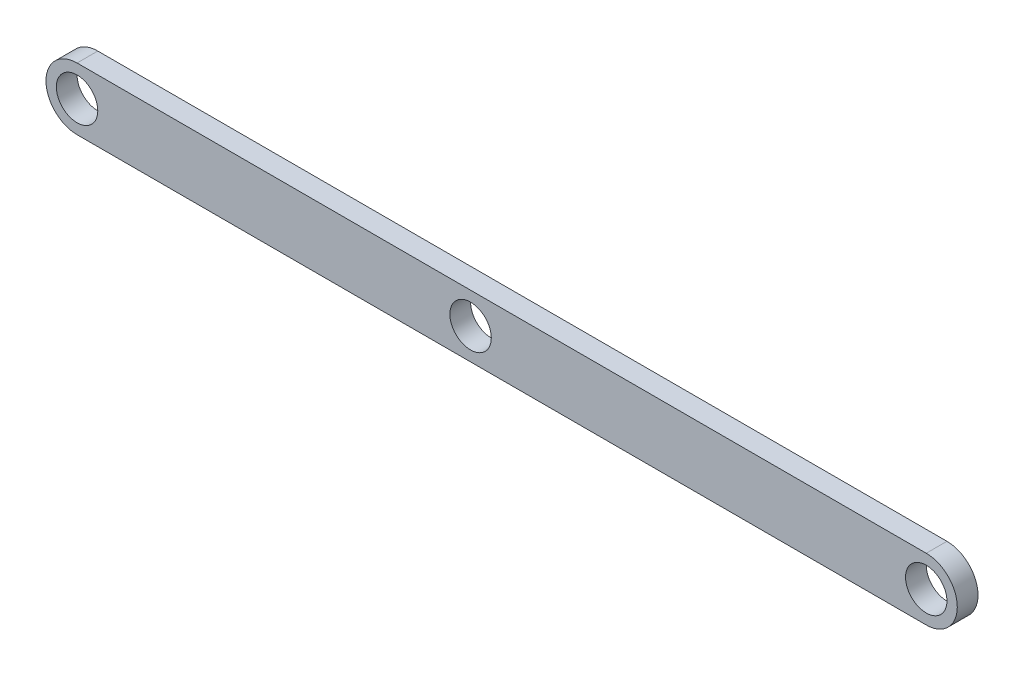
ISO-10303-21;
HEADER;
FILE_DESCRIPTION(('STEP AP214'),'2;1');
FILE_NAME('part.step','',(''),(''),'','','');
FILE_SCHEMA(('AUTOMOTIVE_DESIGN { 1 0 10303 214 1 1 1 1 }'));
ENDSEC;
DATA;
#1=APPLICATION_CONTEXT('core data for automotive mechanical design processes');
#2=APPLICATION_PROTOCOL_DEFINITION('international standard','automotive_design',2000,#1);
#3=PRODUCT_CONTEXT('',#1,'mechanical');
#4=PRODUCT('Part','Part','',(#3));
#5=PRODUCT_RELATED_PRODUCT_CATEGORY('part','',(#4));
#6=PRODUCT_DEFINITION_FORMATION('','',#4);
#7=PRODUCT_DEFINITION_CONTEXT('part definition',#1,'design');
#8=PRODUCT_DEFINITION('design','',#6,#7);
#9=PRODUCT_DEFINITION_SHAPE('','',#8);
#10=(LENGTH_UNIT() NAMED_UNIT(*) SI_UNIT(.MILLI.,.METRE.));
#11=(NAMED_UNIT(*) PLANE_ANGLE_UNIT() SI_UNIT($,.RADIAN.));
#12=(NAMED_UNIT(*) SI_UNIT($,.STERADIAN.) SOLID_ANGLE_UNIT());
#13=UNCERTAINTY_MEASURE_WITH_UNIT(LENGTH_MEASURE(1.E-05),#10,'distance_accuracy_value','');
#14=(GEOMETRIC_REPRESENTATION_CONTEXT(3) GLOBAL_UNCERTAINTY_ASSIGNED_CONTEXT((#13)) GLOBAL_UNIT_ASSIGNED_CONTEXT((#10,
#11,#12)) REPRESENTATION_CONTEXT('',''));
#15=CARTESIAN_POINT('',(0.,0.,0.));
#16=DIRECTION('',(0.,0.,1.));
#17=DIRECTION('',(1.,0.,0.));
#18=AXIS2_PLACEMENT_3D('',#15,#16,#17);
#19=CARTESIAN_POINT('',(0.,0.,10.));
#20=DIRECTION('',(0.,0.,1.));
#21=DIRECTION('',(1.,0.,0.));
#22=AXIS2_PLACEMENT_3D('',#19,#20,#21);
#23=PLANE('',#22);
#24=CARTESIAN_POINT('',(410.,0.,10.));
#25=DIRECTION('',(0.,0.,1.));
#26=DIRECTION('',(1.,0.,0.));
#27=AXIS2_PLACEMENT_3D('',#24,#25,#26);
#28=CIRCLE('',#27,10.);
#29=CARTESIAN_POINT('',(420.,0.,10.));
#30=VERTEX_POINT('',#29);
#31=EDGE_CURVE('E140',#30,#30,#28,.T.);
#32=ORIENTED_EDGE('',*,*,#31,.F.);
#33=EDGE_LOOP('',(#32));
#34=FACE_BOUND('',#33,.T.);
#35=CARTESIAN_POINT('',(0.,0.,10.));
#36=DIRECTION('',(0.,0.,1.));
#37=DIRECTION('',(1.,0.,0.));
#38=AXIS2_PLACEMENT_3D('',#35,#36,#37);
#39=CIRCLE('',#38,15.);
#40=CARTESIAN_POINT('',(0.,15.,10.));
#41=VERTEX_POINT('',#40);
#42=CARTESIAN_POINT('',(0.,-15.,10.));
#43=VERTEX_POINT('',#42);
#44=EDGE_CURVE('E98',#41,#43,#39,.T.);
#45=ORIENTED_EDGE('',*,*,#44,.T.);
#46=DIRECTION('',(1.,0.,0.));
#47=VECTOR('',#46,1.);
#48=CARTESIAN_POINT('',(0.,-15.,10.));
#49=LINE('',#48,#47);
#50=CARTESIAN_POINT('',(410.,-15.,10.));
#51=VERTEX_POINT('',#50);
#52=EDGE_CURVE('E93',#43,#51,#49,.T.);
#53=ORIENTED_EDGE('',*,*,#52,.T.);
#54=CARTESIAN_POINT('',(410.,0.,10.));
#55=DIRECTION('',(0.,0.,1.));
#56=DIRECTION('',(1.,0.,0.));
#57=AXIS2_PLACEMENT_3D('',#54,#55,#56);
#58=CIRCLE('',#57,15.);
#59=CARTESIAN_POINT('',(410.,15.,10.));
#60=VERTEX_POINT('',#59);
#61=EDGE_CURVE('E96',#51,#60,#58,.T.);
#62=ORIENTED_EDGE('',*,*,#61,.T.);
#63=DIRECTION('',(-1.,0.,0.));
#64=VECTOR('',#63,1.);
#65=CARTESIAN_POINT('',(0.,15.,10.));
#66=LINE('',#65,#64);
#67=EDGE_CURVE('E63',#60,#41,#66,.T.);
#68=ORIENTED_EDGE('',*,*,#67,.T.);
#69=EDGE_LOOP('',(#45,#53,#62,#68));
#70=FACE_BOUND('',#69,.T.);
#71=CARTESIAN_POINT('',(0.,0.,10.));
#72=DIRECTION('',(0.,0.,1.));
#73=DIRECTION('',(1.,0.,0.));
#74=AXIS2_PLACEMENT_3D('',#71,#72,#73);
#75=CIRCLE('',#74,10.);
#76=CARTESIAN_POINT('',(10.,0.,10.));
#77=VERTEX_POINT('',#76);
#78=EDGE_CURVE('E118',#77,#77,#75,.T.);
#79=ORIENTED_EDGE('',*,*,#78,.F.);
#80=EDGE_LOOP('',(#79));
#81=FACE_BOUND('',#80,.T.);
#82=CARTESIAN_POINT('',(190.,2.8421709430404E-11,10.));
#83=DIRECTION('',(0.,0.,1.));
#84=DIRECTION('',(1.,0.,0.));
#85=AXIS2_PLACEMENT_3D('',#82,#83,#84);
#86=CIRCLE('',#85,10.);
#87=CARTESIAN_POINT('',(200.,2.8421709430404E-11,10.));
#88=VERTEX_POINT('',#87);
#89=EDGE_CURVE('E148',#88,#88,#86,.T.);
#90=ORIENTED_EDGE('',*,*,#89,.F.);
#91=EDGE_LOOP('',(#90));
#92=FACE_BOUND('',#91,.T.);
#93=ADVANCED_FACE('F45',(#34,#70,#81,#92),#23,.T.);
#94=CARTESIAN_POINT('',(0.,0.,0.));
#95=DIRECTION('',(0.,0.,1.));
#96=DIRECTION('',(1.,0.,0.));
#97=AXIS2_PLACEMENT_3D('',#94,#95,#96);
#98=PLANE('',#97);
#99=CARTESIAN_POINT('',(0.,0.,0.));
#100=DIRECTION('',(0.,0.,1.));
#101=DIRECTION('',(1.,0.,0.));
#102=AXIS2_PLACEMENT_3D('',#99,#100,#101);
#103=CIRCLE('',#102,15.);
#104=CARTESIAN_POINT('',(0.,15.,0.));
#105=VERTEX_POINT('',#104);
#106=CARTESIAN_POINT('',(0.,-15.,0.));
#107=VERTEX_POINT('',#106);
#108=EDGE_CURVE('E114',#105,#107,#103,.T.);
#109=ORIENTED_EDGE('',*,*,#108,.F.);
#110=DIRECTION('',(-1.,0.,0.));
#111=VECTOR('',#110,1.);
#112=CARTESIAN_POINT('',(0.,15.,0.));
#113=LINE('',#112,#111);
#114=CARTESIAN_POINT('',(410.,15.,0.));
#115=VERTEX_POINT('',#114);
#116=EDGE_CURVE('E86',#115,#105,#113,.T.);
#117=ORIENTED_EDGE('',*,*,#116,.F.);
#118=CARTESIAN_POINT('',(410.,0.,0.));
#119=DIRECTION('',(0.,0.,1.));
#120=DIRECTION('',(1.,0.,0.));
#121=AXIS2_PLACEMENT_3D('',#118,#119,#120);
#122=CIRCLE('',#121,15.);
#123=CARTESIAN_POINT('',(410.,-15.,0.));
#124=VERTEX_POINT('',#123);
#125=EDGE_CURVE('E80',#124,#115,#122,.T.);
#126=ORIENTED_EDGE('',*,*,#125,.F.);
#127=DIRECTION('',(1.,0.,0.));
#128=VECTOR('',#127,1.);
#129=CARTESIAN_POINT('',(0.,-15.,0.));
#130=LINE('',#129,#128);
#131=EDGE_CURVE('E103',#107,#124,#130,.T.);
#132=ORIENTED_EDGE('',*,*,#131,.F.);
#133=EDGE_LOOP('',(#109,#117,#126,#132));
#134=FACE_BOUND('',#133,.T.);
#135=CARTESIAN_POINT('',(0.,0.,0.));
#136=DIRECTION('',(0.,0.,1.));
#137=DIRECTION('',(1.,0.,0.));
#138=AXIS2_PLACEMENT_3D('',#135,#136,#137);
#139=CIRCLE('',#138,10.);
#140=CARTESIAN_POINT('',(10.,0.,0.));
#141=VERTEX_POINT('',#140);
#142=EDGE_CURVE('E136',#141,#141,#139,.T.);
#143=ORIENTED_EDGE('',*,*,#142,.T.);
#144=EDGE_LOOP('',(#143));
#145=FACE_BOUND('',#144,.T.);
#146=CARTESIAN_POINT('',(410.,0.,0.));
#147=DIRECTION('',(0.,0.,1.));
#148=DIRECTION('',(1.,0.,0.));
#149=AXIS2_PLACEMENT_3D('',#146,#147,#148);
#150=CIRCLE('',#149,10.);
#151=CARTESIAN_POINT('',(420.,0.,0.));
#152=VERTEX_POINT('',#151);
#153=EDGE_CURVE('E144',#152,#152,#150,.T.);
#154=ORIENTED_EDGE('',*,*,#153,.T.);
#155=EDGE_LOOP('',(#154));
#156=FACE_BOUND('',#155,.T.);
#157=CARTESIAN_POINT('',(190.,2.8421709430404E-11,0.));
#158=DIRECTION('',(0.,0.,1.));
#159=DIRECTION('',(1.,0.,0.));
#160=AXIS2_PLACEMENT_3D('',#157,#158,#159);
#161=CIRCLE('',#160,10.);
#162=CARTESIAN_POINT('',(200.,2.8421709430404E-11,0.));
#163=VERTEX_POINT('',#162);
#164=EDGE_CURVE('E152',#163,#163,#161,.T.);
#165=ORIENTED_EDGE('',*,*,#164,.T.);
#166=EDGE_LOOP('',(#165));
#167=FACE_BOUND('',#166,.T.);
#168=ADVANCED_FACE('F131',(#134,#145,#156,#167),#98,.F.);
#169=CARTESIAN_POINT('',(0.,0.,10.));
#170=DIRECTION('',(0.,0.,-1.));
#171=DIRECTION('',(-1.,0.,0.));
#172=AXIS2_PLACEMENT_3D('',#169,#170,#171);
#173=CYLINDRICAL_SURFACE('',#172,15.);
#174=ORIENTED_EDGE('',*,*,#108,.T.);
#175=DIRECTION('',(0.,0.,-1.));
#176=VECTOR('',#175,1.);
#177=CARTESIAN_POINT('',(0.,-15.,10.));
#178=LINE('',#177,#176);
#179=EDGE_CURVE('E11',#43,#107,#178,.T.);
#180=ORIENTED_EDGE('',*,*,#179,.F.);
#181=ORIENTED_EDGE('',*,*,#44,.F.);
#182=DIRECTION('',(0.,0.,-1.));
#183=VECTOR('',#182,1.);
#184=CARTESIAN_POINT('',(0.,15.,10.));
#185=LINE('',#184,#183);
#186=EDGE_CURVE('E110',#41,#105,#185,.T.);
#187=ORIENTED_EDGE('',*,*,#186,.T.);
#188=EDGE_LOOP('',(#174,#180,#181,#187));
#189=FACE_BOUND('',#188,.T.);
#190=ADVANCED_FACE('F47',(#189),#173,.T.);
#191=CARTESIAN_POINT('',(0.,-15.,10.));
#192=DIRECTION('',(0.,1.,0.));
#193=DIRECTION('',(-1.,0.,0.));
#194=AXIS2_PLACEMENT_3D('',#191,#192,#193);
#195=PLANE('',#194);
#196=ORIENTED_EDGE('',*,*,#131,.T.);
#197=DIRECTION('',(0.,0.,-1.));
#198=VECTOR('',#197,1.);
#199=CARTESIAN_POINT('',(410.,-15.,10.));
#200=LINE('',#199,#198);
#201=EDGE_CURVE('E55',#51,#124,#200,.T.);
#202=ORIENTED_EDGE('',*,*,#201,.F.);
#203=ORIENTED_EDGE('',*,*,#52,.F.);
#204=ORIENTED_EDGE('',*,*,#179,.T.);
#205=EDGE_LOOP('',(#196,#202,#203,#204));
#206=FACE_BOUND('',#205,.T.);
#207=ADVANCED_FACE('F102',(#206),#195,.F.);
#208=CARTESIAN_POINT('',(410.,0.,10.));
#209=DIRECTION('',(0.,0.,-1.));
#210=DIRECTION('',(-1.,0.,0.));
#211=AXIS2_PLACEMENT_3D('',#208,#209,#210);
#212=CYLINDRICAL_SURFACE('',#211,15.);
#213=ORIENTED_EDGE('',*,*,#125,.T.);
#214=DIRECTION('',(0.,0.,-1.));
#215=VECTOR('',#214,1.);
#216=CARTESIAN_POINT('',(410.,15.,10.));
#217=LINE('',#216,#215);
#218=EDGE_CURVE('E105',#60,#115,#217,.T.);
#219=ORIENTED_EDGE('',*,*,#218,.F.);
#220=ORIENTED_EDGE('',*,*,#61,.F.);
#221=ORIENTED_EDGE('',*,*,#201,.T.);
#222=EDGE_LOOP('',(#213,#219,#220,#221));
#223=FACE_BOUND('',#222,.T.);
#224=ADVANCED_FACE('F106',(#223),#212,.T.);
#225=CARTESIAN_POINT('',(0.,15.,10.));
#226=DIRECTION('',(0.,-1.,0.));
#227=DIRECTION('',(1.,0.,0.));
#228=AXIS2_PLACEMENT_3D('',#225,#226,#227);
#229=PLANE('',#228);
#230=ORIENTED_EDGE('',*,*,#116,.T.);
#231=ORIENTED_EDGE('',*,*,#186,.F.);
#232=ORIENTED_EDGE('',*,*,#67,.F.);
#233=ORIENTED_EDGE('',*,*,#218,.T.);
#234=EDGE_LOOP('',(#230,#231,#232,#233));
#235=FACE_BOUND('',#234,.T.);
#236=ADVANCED_FACE('F128',(#235),#229,.F.);
#237=CARTESIAN_POINT('',(0.,0.,10.));
#238=DIRECTION('',(0.,0.,-1.));
#239=DIRECTION('',(-1.,0.,0.));
#240=AXIS2_PLACEMENT_3D('',#237,#238,#239);
#241=CYLINDRICAL_SURFACE('',#240,10.);
#242=ORIENTED_EDGE('',*,*,#78,.T.);
#243=EDGE_LOOP('',(#242));
#244=FACE_BOUND('',#243,.T.);
#245=ORIENTED_EDGE('',*,*,#142,.F.);
#246=EDGE_LOOP('',(#245));
#247=FACE_BOUND('',#246,.T.);
#248=ADVANCED_FACE('F172',(#244,#247),#241,.F.);
#249=CARTESIAN_POINT('',(410.,0.,10.));
#250=DIRECTION('',(0.,0.,-1.));
#251=DIRECTION('',(-1.,0.,0.));
#252=AXIS2_PLACEMENT_3D('',#249,#250,#251);
#253=CYLINDRICAL_SURFACE('',#252,10.);
#254=ORIENTED_EDGE('',*,*,#31,.T.);
#255=EDGE_LOOP('',(#254));
#256=FACE_BOUND('',#255,.T.);
#257=ORIENTED_EDGE('',*,*,#153,.F.);
#258=EDGE_LOOP('',(#257));
#259=FACE_BOUND('',#258,.T.);
#260=ADVANCED_FACE('F217',(#256,#259),#253,.F.);
#261=CARTESIAN_POINT('',(190.,2.8421709430404E-11,10.));
#262=DIRECTION('',(0.,0.,-1.));
#263=DIRECTION('',(-1.,0.,0.));
#264=AXIS2_PLACEMENT_3D('',#261,#262,#263);
#265=CYLINDRICAL_SURFACE('',#264,10.);
#266=ORIENTED_EDGE('',*,*,#89,.T.);
#267=EDGE_LOOP('',(#266));
#268=FACE_BOUND('',#267,.T.);
#269=ORIENTED_EDGE('',*,*,#164,.F.);
#270=EDGE_LOOP('',(#269));
#271=FACE_BOUND('',#270,.T.);
#272=ADVANCED_FACE('F160',(#268,#271),#265,.F.);
#273=CLOSED_SHELL('',(#93,#168,#190,#207,#224,#236,#248,#260,#272));
#274=MANIFOLD_SOLID_BREP('B2',#273);
#275=ADVANCED_BREP_SHAPE_REPRESENTATION('',(#18,#274),#14);
#276=SHAPE_DEFINITION_REPRESENTATION(#9,#275);
ENDSEC;
END-ISO-10303-21;
